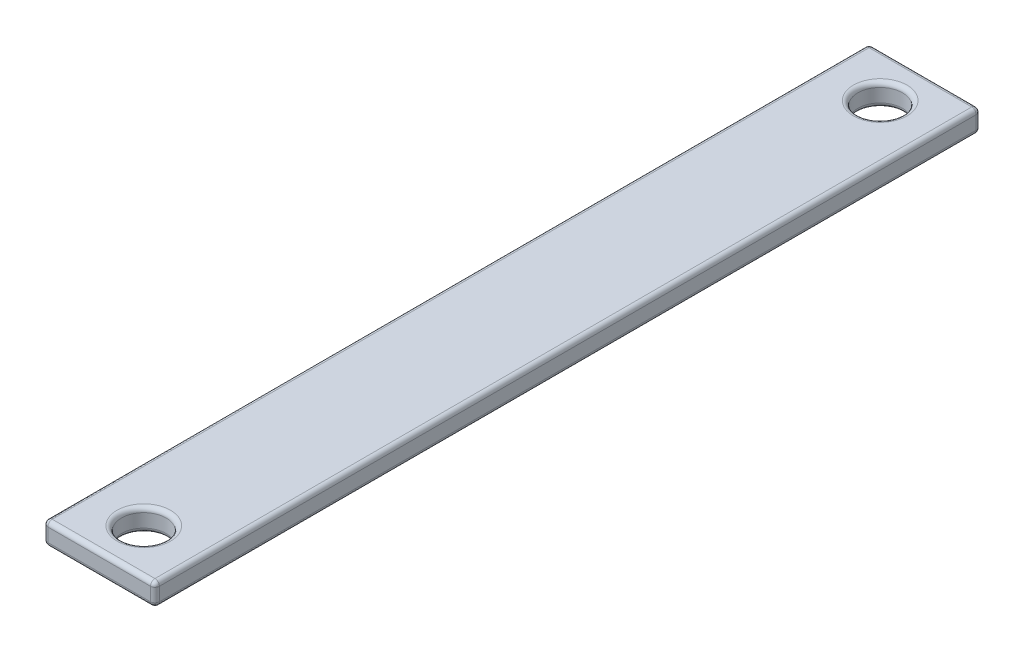
ISO-10303-21;
HEADER;
FILE_DESCRIPTION(('STEP AP214'),'2;1');
FILE_NAME('part.step','',(''),(''),'','','');
FILE_SCHEMA(('AUTOMOTIVE_DESIGN { 1 0 10303 214 1 1 1 1 }'));
ENDSEC;
DATA;
#1=APPLICATION_CONTEXT('core data for automotive mechanical design processes');
#2=APPLICATION_PROTOCOL_DEFINITION('international standard','automotive_design',2000,#1);
#3=PRODUCT_CONTEXT('',#1,'mechanical');
#4=PRODUCT('Part','Part','',(#3));
#5=PRODUCT_RELATED_PRODUCT_CATEGORY('part','',(#4));
#6=PRODUCT_DEFINITION_FORMATION('','',#4);
#7=PRODUCT_DEFINITION_CONTEXT('part definition',#1,'design');
#8=PRODUCT_DEFINITION('design','',#6,#7);
#9=PRODUCT_DEFINITION_SHAPE('','',#8);
#10=(LENGTH_UNIT() NAMED_UNIT(*) SI_UNIT(.MILLI.,.METRE.));
#11=(NAMED_UNIT(*) PLANE_ANGLE_UNIT() SI_UNIT($,.RADIAN.));
#12=(NAMED_UNIT(*) SI_UNIT($,.STERADIAN.) SOLID_ANGLE_UNIT());
#13=UNCERTAINTY_MEASURE_WITH_UNIT(LENGTH_MEASURE(1.E-05),#10,'distance_accuracy_value','');
#14=(GEOMETRIC_REPRESENTATION_CONTEXT(3) GLOBAL_UNCERTAINTY_ASSIGNED_CONTEXT((#13)) GLOBAL_UNIT_ASSIGNED_CONTEXT((#10,
#11,#12)) REPRESENTATION_CONTEXT('',''));
#15=CARTESIAN_POINT('',(0.,0.,0.));
#16=DIRECTION('',(0.,0.,1.));
#17=DIRECTION('',(1.,0.,0.));
#18=AXIS2_PLACEMENT_3D('',#15,#16,#17);
#19=CARTESIAN_POINT('',(0.,10.,0.));
#20=DIRECTION('',(0.,-1.,0.));
#21=DIRECTION('',(0.,0.,-1.));
#22=AXIS2_PLACEMENT_3D('',#19,#20,#21);
#23=PLANE('',#22);
#24=CARTESIAN_POINT('',(0.,10.,165.));
#25=DIRECTION('',(0.,-1.,0.));
#26=DIRECTION('',(0.,0.,-1.));
#27=AXIS2_PLACEMENT_3D('',#24,#25,#26);
#28=CIRCLE('',#27,12.);
#29=CARTESIAN_POINT('',(0.,10.,153.));
#30=VERTEX_POINT('',#29);
#31=EDGE_CURVE('E171',#30,#30,#28,.T.);
#32=ORIENTED_EDGE('',*,*,#31,.T.);
#33=EDGE_LOOP('',(#32));
#34=FACE_BOUND('',#33,.T.);
#35=CARTESIAN_POINT('',(0.,10.,-165.));
#36=DIRECTION('',(0.,-1.,0.));
#37=DIRECTION('',(0.,0.,-1.));
#38=AXIS2_PLACEMENT_3D('',#35,#36,#37);
#39=CIRCLE('',#38,12.);
#40=CARTESIAN_POINT('',(0.,10.,-177.));
#41=VERTEX_POINT('',#40);
#42=EDGE_CURVE('E168',#41,#41,#39,.T.);
#43=ORIENTED_EDGE('',*,*,#42,.T.);
#44=EDGE_LOOP('',(#43));
#45=FACE_BOUND('',#44,.T.);
#46=DIRECTION('',(0.,0.,1.));
#47=VECTOR('',#46,1.);
#48=CARTESIAN_POINT('',(-23.,10.,0.));
#49=LINE('',#48,#47);
#50=CARTESIAN_POINT('',(-23.,10.,-183.));
#51=VERTEX_POINT('',#50);
#52=CARTESIAN_POINT('',(-23.,10.,183.));
#53=VERTEX_POINT('',#52);
#54=EDGE_CURVE('E167',#51,#53,#49,.T.);
#55=ORIENTED_EDGE('',*,*,#54,.T.);
#56=DIRECTION('',(1.,0.,0.));
#57=VECTOR('',#56,1.);
#58=CARTESIAN_POINT('',(0.,10.,183.));
#59=LINE('',#58,#57);
#60=CARTESIAN_POINT('',(23.,10.,183.));
#61=VERTEX_POINT('',#60);
#62=EDGE_CURVE('E147',#53,#61,#59,.T.);
#63=ORIENTED_EDGE('',*,*,#62,.T.);
#64=DIRECTION('',(0.,0.,-1.));
#65=VECTOR('',#64,1.);
#66=CARTESIAN_POINT('',(23.,10.,0.));
#67=LINE('',#66,#65);
#68=CARTESIAN_POINT('',(23.,10.,-183.));
#69=VERTEX_POINT('',#68);
#70=EDGE_CURVE('E156',#61,#69,#67,.T.);
#71=ORIENTED_EDGE('',*,*,#70,.T.);
#72=DIRECTION('',(-1.,0.,0.));
#73=VECTOR('',#72,1.);
#74=CARTESIAN_POINT('',(0.,10.,-183.));
#75=LINE('',#74,#73);
#76=EDGE_CURVE('E162',#69,#51,#75,.T.);
#77=ORIENTED_EDGE('',*,*,#76,.T.);
#78=EDGE_LOOP('',(#55,#63,#71,#77));
#79=FACE_BOUND('',#78,.T.);
#80=ADVANCED_FACE('F37',(#34,#45,#79),#23,.F.);
#81=CARTESIAN_POINT('',(0.,0.,0.));
#82=DIRECTION('',(0.,-1.,0.));
#83=DIRECTION('',(0.,0.,-1.));
#84=AXIS2_PLACEMENT_3D('',#81,#82,#83);
#85=PLANE('',#84);
#86=CARTESIAN_POINT('',(0.,0.,165.));
#87=DIRECTION('',(0.,-1.,0.));
#88=DIRECTION('',(0.,0.,-1.));
#89=AXIS2_PLACEMENT_3D('',#86,#87,#88);
#90=CIRCLE('',#89,12.);
#91=CARTESIAN_POINT('',(0.,0.,153.));
#92=VERTEX_POINT('',#91);
#93=EDGE_CURVE('E152',#92,#92,#90,.F.);
#94=ORIENTED_EDGE('',*,*,#93,.T.);
#95=EDGE_LOOP('',(#94));
#96=FACE_BOUND('',#95,.T.);
#97=DIRECTION('',(0.,0.,1.));
#98=VECTOR('',#97,1.);
#99=CARTESIAN_POINT('',(-23.,0.,-185.));
#100=LINE('',#99,#98);
#101=CARTESIAN_POINT('',(-23.,0.,183.));
#102=VERTEX_POINT('',#101);
#103=CARTESIAN_POINT('',(-23.,0.,-183.));
#104=VERTEX_POINT('',#103);
#105=EDGE_CURVE('E212',#102,#104,#100,.F.);
#106=ORIENTED_EDGE('',*,*,#105,.T.);
#107=DIRECTION('',(-1.,0.,0.));
#108=VECTOR('',#107,1.);
#109=CARTESIAN_POINT('',(25.,0.,-183.));
#110=LINE('',#109,#108);
#111=CARTESIAN_POINT('',(23.,0.,-183.));
#112=VERTEX_POINT('',#111);
#113=EDGE_CURVE('E215',#104,#112,#110,.F.);
#114=ORIENTED_EDGE('',*,*,#113,.T.);
#115=DIRECTION('',(0.,0.,-1.));
#116=VECTOR('',#115,1.);
#117=CARTESIAN_POINT('',(23.,0.,185.));
#118=LINE('',#117,#116);
#119=CARTESIAN_POINT('',(23.,0.,183.));
#120=VERTEX_POINT('',#119);
#121=EDGE_CURVE('E206',#112,#120,#118,.F.);
#122=ORIENTED_EDGE('',*,*,#121,.T.);
#123=DIRECTION('',(1.,0.,0.));
#124=VECTOR('',#123,1.);
#125=CARTESIAN_POINT('',(-25.,0.,183.));
#126=LINE('',#125,#124);
#127=EDGE_CURVE('E209',#120,#102,#126,.F.);
#128=ORIENTED_EDGE('',*,*,#127,.T.);
#129=EDGE_LOOP('',(#106,#114,#122,#128));
#130=FACE_BOUND('',#129,.T.);
#131=CARTESIAN_POINT('',(0.,0.,-165.));
#132=DIRECTION('',(0.,-1.,0.));
#133=DIRECTION('',(0.,0.,-1.));
#134=AXIS2_PLACEMENT_3D('',#131,#132,#133);
#135=CIRCLE('',#134,12.);
#136=CARTESIAN_POINT('',(0.,0.,-177.));
#137=VERTEX_POINT('',#136);
#138=EDGE_CURVE('E203',#137,#137,#135,.F.);
#139=ORIENTED_EDGE('',*,*,#138,.T.);
#140=EDGE_LOOP('',(#139));
#141=FACE_BOUND('',#140,.T.);
#142=ADVANCED_FACE('F292',(#96,#130,#141),#85,.T.);
#143=CARTESIAN_POINT('',(25.,10.,185.));
#144=DIRECTION('',(-1.,0.,0.));
#145=DIRECTION('',(0.,0.,1.));
#146=AXIS2_PLACEMENT_3D('',#143,#144,#145);
#147=PLANE('',#146);
#148=DIRECTION('',(0.,0.,-1.));
#149=VECTOR('',#148,1.);
#150=CARTESIAN_POINT('',(25.,8.,185.));
#151=LINE('',#150,#149);
#152=CARTESIAN_POINT('',(25.,8.,-183.));
#153=VERTEX_POINT('',#152);
#154=CARTESIAN_POINT('',(25.,8.,183.));
#155=VERTEX_POINT('',#154);
#156=EDGE_CURVE('E201',#153,#155,#151,.F.);
#157=ORIENTED_EDGE('',*,*,#156,.T.);
#158=DIRECTION('',(0.,-1.,0.));
#159=VECTOR('',#158,1.);
#160=CARTESIAN_POINT('',(25.,10.,183.));
#161=LINE('',#160,#159);
#162=CARTESIAN_POINT('',(25.,2.,183.));
#163=VERTEX_POINT('',#162);
#164=EDGE_CURVE('E255',#155,#163,#161,.T.);
#165=ORIENTED_EDGE('',*,*,#164,.T.);
#166=DIRECTION('',(0.,0.,-1.));
#167=VECTOR('',#166,1.);
#168=CARTESIAN_POINT('',(25.,2.,-185.));
#169=LINE('',#168,#167);
#170=CARTESIAN_POINT('',(25.,2.,-183.));
#171=VERTEX_POINT('',#170);
#172=EDGE_CURVE('E198',#163,#171,#169,.T.);
#173=ORIENTED_EDGE('',*,*,#172,.T.);
#174=DIRECTION('',(0.,-1.,0.));
#175=VECTOR('',#174,1.);
#176=CARTESIAN_POINT('',(25.,10.,-183.));
#177=LINE('',#176,#175);
#178=EDGE_CURVE('E253',#171,#153,#177,.F.);
#179=ORIENTED_EDGE('',*,*,#178,.T.);
#180=EDGE_LOOP('',(#157,#165,#173,#179));
#181=FACE_BOUND('',#180,.T.);
#182=ADVANCED_FACE('F350',(#181),#147,.F.);
#183=CARTESIAN_POINT('',(-25.,10.,-185.));
#184=DIRECTION('',(0.,0.,1.));
#185=DIRECTION('',(1.,0.,0.));
#186=AXIS2_PLACEMENT_3D('',#183,#184,#185);
#187=PLANE('',#186);
#188=DIRECTION('',(-1.,0.,0.));
#189=VECTOR('',#188,1.);
#190=CARTESIAN_POINT('',(-25.,8.,-185.));
#191=LINE('',#190,#189);
#192=CARTESIAN_POINT('',(-23.,8.,-185.));
#193=VERTEX_POINT('',#192);
#194=CARTESIAN_POINT('',(23.,8.,-185.));
#195=VERTEX_POINT('',#194);
#196=EDGE_CURVE('E196',#193,#195,#191,.F.);
#197=ORIENTED_EDGE('',*,*,#196,.T.);
#198=DIRECTION('',(0.,-1.,0.));
#199=VECTOR('',#198,1.);
#200=CARTESIAN_POINT('',(23.,10.,-185.));
#201=LINE('',#200,#199);
#202=CARTESIAN_POINT('',(23.,2.,-185.));
#203=VERTEX_POINT('',#202);
#204=EDGE_CURVE('E12',#195,#203,#201,.T.);
#205=ORIENTED_EDGE('',*,*,#204,.T.);
#206=DIRECTION('',(-1.,0.,0.));
#207=VECTOR('',#206,1.);
#208=CARTESIAN_POINT('',(-25.,2.,-185.));
#209=LINE('',#208,#207);
#210=CARTESIAN_POINT('',(-23.,2.,-185.));
#211=VERTEX_POINT('',#210);
#212=EDGE_CURVE('E194',#203,#211,#209,.T.);
#213=ORIENTED_EDGE('',*,*,#212,.T.);
#214=DIRECTION('',(0.,-1.,0.));
#215=VECTOR('',#214,1.);
#216=CARTESIAN_POINT('',(-23.,10.,-185.));
#217=LINE('',#216,#215);
#218=EDGE_CURVE('E46',#211,#193,#217,.F.);
#219=ORIENTED_EDGE('',*,*,#218,.T.);
#220=EDGE_LOOP('',(#197,#205,#213,#219));
#221=FACE_BOUND('',#220,.T.);
#222=ADVANCED_FACE('F362',(#221),#187,.F.);
#223=CARTESIAN_POINT('',(-25.,10.,185.));
#224=DIRECTION('',(1.,0.,0.));
#225=DIRECTION('',(0.,0.,-1.));
#226=AXIS2_PLACEMENT_3D('',#223,#224,#225);
#227=PLANE('',#226);
#228=DIRECTION('',(0.,0.,1.));
#229=VECTOR('',#228,1.);
#230=CARTESIAN_POINT('',(-25.,2.,185.));
#231=LINE('',#230,#229);
#232=CARTESIAN_POINT('',(-25.,2.,-183.));
#233=VERTEX_POINT('',#232);
#234=CARTESIAN_POINT('',(-25.,2.,183.));
#235=VERTEX_POINT('',#234);
#236=EDGE_CURVE('E188',#233,#235,#231,.T.);
#237=ORIENTED_EDGE('',*,*,#236,.T.);
#238=DIRECTION('',(0.,-1.,0.));
#239=VECTOR('',#238,1.);
#240=CARTESIAN_POINT('',(-25.,10.,183.));
#241=LINE('',#240,#239);
#242=CARTESIAN_POINT('',(-25.,8.,183.));
#243=VERTEX_POINT('',#242);
#244=EDGE_CURVE('E251',#235,#243,#241,.F.);
#245=ORIENTED_EDGE('',*,*,#244,.T.);
#246=DIRECTION('',(0.,0.,1.));
#247=VECTOR('',#246,1.);
#248=CARTESIAN_POINT('',(-25.,8.,185.));
#249=LINE('',#248,#247);
#250=CARTESIAN_POINT('',(-25.,8.,-183.));
#251=VERTEX_POINT('',#250);
#252=EDGE_CURVE('E191',#243,#251,#249,.F.);
#253=ORIENTED_EDGE('',*,*,#252,.T.);
#254=DIRECTION('',(0.,-1.,0.));
#255=VECTOR('',#254,1.);
#256=CARTESIAN_POINT('',(-25.,10.,-183.));
#257=LINE('',#256,#255);
#258=EDGE_CURVE('E249',#251,#233,#257,.T.);
#259=ORIENTED_EDGE('',*,*,#258,.T.);
#260=EDGE_LOOP('',(#237,#245,#253,#259));
#261=FACE_BOUND('',#260,.T.);
#262=ADVANCED_FACE('F329',(#261),#227,.F.);
#263=CARTESIAN_POINT('',(-25.,10.,185.));
#264=DIRECTION('',(0.,0.,-1.));
#265=DIRECTION('',(-1.,0.,0.));
#266=AXIS2_PLACEMENT_3D('',#263,#264,#265);
#267=PLANE('',#266);
#268=DIRECTION('',(1.,0.,0.));
#269=VECTOR('',#268,1.);
#270=CARTESIAN_POINT('',(-25.,8.,185.));
#271=LINE('',#270,#269);
#272=CARTESIAN_POINT('',(23.,8.,185.));
#273=VERTEX_POINT('',#272);
#274=CARTESIAN_POINT('',(-23.,8.,185.));
#275=VERTEX_POINT('',#274);
#276=EDGE_CURVE('E150',#273,#275,#271,.F.);
#277=ORIENTED_EDGE('',*,*,#276,.T.);
#278=DIRECTION('',(0.,-1.,0.));
#279=VECTOR('',#278,1.);
#280=CARTESIAN_POINT('',(-23.,10.,185.));
#281=LINE('',#280,#279);
#282=CARTESIAN_POINT('',(-23.,2.,185.));
#283=VERTEX_POINT('',#282);
#284=EDGE_CURVE('E247',#275,#283,#281,.T.);
#285=ORIENTED_EDGE('',*,*,#284,.T.);
#286=DIRECTION('',(1.,0.,0.));
#287=VECTOR('',#286,1.);
#288=CARTESIAN_POINT('',(25.,2.,185.));
#289=LINE('',#288,#287);
#290=CARTESIAN_POINT('',(23.,2.,185.));
#291=VERTEX_POINT('',#290);
#292=EDGE_CURVE('E184',#283,#291,#289,.T.);
#293=ORIENTED_EDGE('',*,*,#292,.T.);
#294=DIRECTION('',(0.,-1.,0.));
#295=VECTOR('',#294,1.);
#296=CARTESIAN_POINT('',(23.,10.,185.));
#297=LINE('',#296,#295);
#298=EDGE_CURVE('E245',#291,#273,#297,.F.);
#299=ORIENTED_EDGE('',*,*,#298,.T.);
#300=EDGE_LOOP('',(#277,#285,#293,#299));
#301=FACE_BOUND('',#300,.T.);
#302=ADVANCED_FACE('F318',(#301),#267,.F.);
#303=CARTESIAN_POINT('',(0.,10.,-165.));
#304=DIRECTION('',(0.,-1.,0.));
#305=DIRECTION('',(0.,0.,-1.));
#306=AXIS2_PLACEMENT_3D('',#303,#304,#305);
#307=CYLINDRICAL_SURFACE('',#306,10.);
#308=CARTESIAN_POINT('',(0.,8.,-165.));
#309=DIRECTION('',(0.,-1.,0.));
#310=DIRECTION('',(0.,0.,-1.));
#311=AXIS2_PLACEMENT_3D('',#308,#309,#310);
#312=CIRCLE('',#311,10.);
#313=CARTESIAN_POINT('',(0.,8.,-175.));
#314=VERTEX_POINT('',#313);
#315=EDGE_CURVE('E181',#314,#314,#312,.F.);
#316=ORIENTED_EDGE('',*,*,#315,.T.);
#317=EDGE_LOOP('',(#316));
#318=FACE_BOUND('',#317,.T.);
#319=CARTESIAN_POINT('',(0.,2.,-165.));
#320=DIRECTION('',(0.,-1.,0.));
#321=DIRECTION('',(0.,0.,-1.));
#322=AXIS2_PLACEMENT_3D('',#319,#320,#321);
#323=CIRCLE('',#322,10.);
#324=CARTESIAN_POINT('',(0.,2.,-175.));
#325=VERTEX_POINT('',#324);
#326=EDGE_CURVE('E178',#325,#325,#323,.T.);
#327=ORIENTED_EDGE('',*,*,#326,.T.);
#328=EDGE_LOOP('',(#327));
#329=FACE_BOUND('',#328,.T.);
#330=ADVANCED_FACE('F355',(#318,#329),#307,.F.);
#331=CARTESIAN_POINT('',(0.,10.,165.));
#332=DIRECTION('',(0.,-1.,0.));
#333=DIRECTION('',(0.,0.,-1.));
#334=AXIS2_PLACEMENT_3D('',#331,#332,#333);
#335=CYLINDRICAL_SURFACE('',#334,10.);
#336=CARTESIAN_POINT('',(0.,8.,165.));
#337=DIRECTION('',(0.,-1.,0.));
#338=DIRECTION('',(0.,0.,-1.));
#339=AXIS2_PLACEMENT_3D('',#336,#337,#338);
#340=CIRCLE('',#339,10.);
#341=CARTESIAN_POINT('',(0.,8.,155.));
#342=VERTEX_POINT('',#341);
#343=EDGE_CURVE('E163',#342,#342,#340,.F.);
#344=ORIENTED_EDGE('',*,*,#343,.T.);
#345=EDGE_LOOP('',(#344));
#346=FACE_BOUND('',#345,.T.);
#347=CARTESIAN_POINT('',(0.,2.,165.));
#348=DIRECTION('',(0.,-1.,0.));
#349=DIRECTION('',(0.,0.,-1.));
#350=AXIS2_PLACEMENT_3D('',#347,#348,#349);
#351=CIRCLE('',#350,10.);
#352=CARTESIAN_POINT('',(0.,2.,155.));
#353=VERTEX_POINT('',#352);
#354=EDGE_CURVE('E264',#353,#353,#351,.T.);
#355=ORIENTED_EDGE('',*,*,#354,.T.);
#356=EDGE_LOOP('',(#355));
#357=FACE_BOUND('',#356,.T.);
#358=ADVANCED_FACE('F372',(#346,#357),#335,.F.);
#359=CARTESIAN_POINT('',(0.,8.,165.));
#360=DIRECTION('',(0.,-1.,0.));
#361=DIRECTION('',(0.,0.,-1.));
#362=AXIS2_PLACEMENT_3D('',#359,#360,#361);
#363=TOROIDAL_SURFACE('',#362,12.,2.);
#364=ORIENTED_EDGE('',*,*,#31,.F.);
#365=EDGE_LOOP('',(#364));
#366=FACE_BOUND('',#365,.T.);
#367=ORIENTED_EDGE('',*,*,#343,.F.);
#368=EDGE_LOOP('',(#367));
#369=FACE_BOUND('',#368,.T.);
#370=ADVANCED_FACE('F368',(#366,#369),#363,.T.);
#371=CARTESIAN_POINT('',(0.,8.,-165.));
#372=DIRECTION('',(0.,-1.,0.));
#373=DIRECTION('',(0.,0.,-1.));
#374=AXIS2_PLACEMENT_3D('',#371,#372,#373);
#375=TOROIDAL_SURFACE('',#374,12.,2.);
#376=ORIENTED_EDGE('',*,*,#42,.F.);
#377=EDGE_LOOP('',(#376));
#378=FACE_BOUND('',#377,.T.);
#379=ORIENTED_EDGE('',*,*,#315,.F.);
#380=EDGE_LOOP('',(#379));
#381=FACE_BOUND('',#380,.T.);
#382=ADVANCED_FACE('F371',(#378,#381),#375,.T.);
#383=CARTESIAN_POINT('',(0.,8.,-183.));
#384=DIRECTION('',(-1.,0.,0.));
#385=DIRECTION('',(0.,0.,1.));
#386=AXIS2_PLACEMENT_3D('',#383,#384,#385);
#387=CYLINDRICAL_SURFACE('',#386,2.);
#388=ORIENTED_EDGE('',*,*,#76,.F.);
#389=CARTESIAN_POINT('',(23.,8.,-183.));
#390=DIRECTION('',(-1.,0.,0.));
#391=DIRECTION('',(0.,0.,1.));
#392=AXIS2_PLACEMENT_3D('',#389,#390,#391);
#393=CIRCLE('',#392,2.);
#394=EDGE_CURVE('E240',#69,#195,#393,.T.);
#395=ORIENTED_EDGE('',*,*,#394,.T.);
#396=ORIENTED_EDGE('',*,*,#196,.F.);
#397=CARTESIAN_POINT('',(-23.,8.,-183.));
#398=DIRECTION('',(-1.,0.,0.));
#399=DIRECTION('',(0.,0.,1.));
#400=AXIS2_PLACEMENT_3D('',#397,#398,#399);
#401=CIRCLE('',#400,2.);
#402=EDGE_CURVE('E238',#193,#51,#401,.F.);
#403=ORIENTED_EDGE('',*,*,#402,.T.);
#404=EDGE_LOOP('',(#388,#395,#396,#403));
#405=FACE_BOUND('',#404,.T.);
#406=ADVANCED_FACE('F376',(#405),#387,.T.);
#407=CARTESIAN_POINT('',(-23.,8.,0.));
#408=DIRECTION('',(0.,0.,1.));
#409=DIRECTION('',(1.,0.,0.));
#410=AXIS2_PLACEMENT_3D('',#407,#408,#409);
#411=CYLINDRICAL_SURFACE('',#410,2.);
#412=ORIENTED_EDGE('',*,*,#252,.F.);
#413=CARTESIAN_POINT('',(-23.,8.,183.));
#414=DIRECTION('',(0.,0.,1.));
#415=DIRECTION('',(1.,0.,0.));
#416=AXIS2_PLACEMENT_3D('',#413,#414,#415);
#417=CIRCLE('',#416,2.);
#418=EDGE_CURVE('E224',#243,#53,#417,.F.);
#419=ORIENTED_EDGE('',*,*,#418,.T.);
#420=ORIENTED_EDGE('',*,*,#54,.F.);
#421=CARTESIAN_POINT('',(-23.,8.,-183.));
#422=DIRECTION('',(0.,0.,1.));
#423=DIRECTION('',(1.,0.,0.));
#424=AXIS2_PLACEMENT_3D('',#421,#422,#423);
#425=CIRCLE('',#424,2.);
#426=EDGE_CURVE('E221',#51,#251,#425,.T.);
#427=ORIENTED_EDGE('',*,*,#426,.T.);
#428=EDGE_LOOP('',(#412,#419,#420,#427));
#429=FACE_BOUND('',#428,.T.);
#430=ADVANCED_FACE('F332',(#429),#411,.T.);
#431=CARTESIAN_POINT('',(23.,8.,0.));
#432=DIRECTION('',(0.,0.,-1.));
#433=DIRECTION('',(-1.,0.,0.));
#434=AXIS2_PLACEMENT_3D('',#431,#432,#433);
#435=CYLINDRICAL_SURFACE('',#434,2.);
#436=ORIENTED_EDGE('',*,*,#70,.F.);
#437=CARTESIAN_POINT('',(23.,8.,183.));
#438=DIRECTION('',(0.,0.,-1.));
#439=DIRECTION('',(-1.,0.,0.));
#440=AXIS2_PLACEMENT_3D('',#437,#438,#439);
#441=CIRCLE('',#440,2.);
#442=EDGE_CURVE('E128',#61,#155,#441,.T.);
#443=ORIENTED_EDGE('',*,*,#442,.T.);
#444=ORIENTED_EDGE('',*,*,#156,.F.);
#445=CARTESIAN_POINT('',(23.,8.,-183.));
#446=DIRECTION('',(0.,0.,-1.));
#447=DIRECTION('',(-1.,0.,0.));
#448=AXIS2_PLACEMENT_3D('',#445,#446,#447);
#449=CIRCLE('',#448,2.);
#450=EDGE_CURVE('E139',#153,#69,#449,.F.);
#451=ORIENTED_EDGE('',*,*,#450,.T.);
#452=EDGE_LOOP('',(#436,#443,#444,#451));
#453=FACE_BOUND('',#452,.T.);
#454=ADVANCED_FACE('F157',(#453),#435,.T.);
#455=CARTESIAN_POINT('',(0.,8.,183.));
#456=DIRECTION('',(1.,0.,0.));
#457=DIRECTION('',(0.,0.,-1.));
#458=AXIS2_PLACEMENT_3D('',#455,#456,#457);
#459=CYLINDRICAL_SURFACE('',#458,2.);
#460=ORIENTED_EDGE('',*,*,#62,.F.);
#461=CARTESIAN_POINT('',(-23.,8.,183.));
#462=DIRECTION('',(1.,0.,0.));
#463=DIRECTION('',(0.,0.,-1.));
#464=AXIS2_PLACEMENT_3D('',#461,#462,#463);
#465=CIRCLE('',#464,2.);
#466=EDGE_CURVE('E151',#53,#275,#465,.T.);
#467=ORIENTED_EDGE('',*,*,#466,.T.);
#468=ORIENTED_EDGE('',*,*,#276,.F.);
#469=CARTESIAN_POINT('',(23.,8.,183.));
#470=DIRECTION('',(1.,0.,0.));
#471=DIRECTION('',(0.,0.,-1.));
#472=AXIS2_PLACEMENT_3D('',#469,#470,#471);
#473=CIRCLE('',#472,2.);
#474=EDGE_CURVE('E131',#273,#61,#473,.F.);
#475=ORIENTED_EDGE('',*,*,#474,.T.);
#476=EDGE_LOOP('',(#460,#467,#468,#475));
#477=FACE_BOUND('',#476,.T.);
#478=ADVANCED_FACE('F144',(#477),#459,.T.);
#479=CARTESIAN_POINT('',(0.,2.,165.));
#480=DIRECTION('',(0.,-1.,0.));
#481=DIRECTION('',(0.,0.,-1.));
#482=AXIS2_PLACEMENT_3D('',#479,#480,#481);
#483=TOROIDAL_SURFACE('',#482,12.,2.);
#484=ORIENTED_EDGE('',*,*,#354,.F.);
#485=EDGE_LOOP('',(#484));
#486=FACE_BOUND('',#485,.T.);
#487=ORIENTED_EDGE('',*,*,#93,.F.);
#488=EDGE_LOOP('',(#487));
#489=FACE_BOUND('',#488,.T.);
#490=ADVANCED_FACE('F380',(#486,#489),#483,.T.);
#491=CARTESIAN_POINT('',(-25.,2.,183.));
#492=DIRECTION('',(-1.,0.,0.));
#493=DIRECTION('',(0.,0.,1.));
#494=AXIS2_PLACEMENT_3D('',#491,#492,#493);
#495=CYLINDRICAL_SURFACE('',#494,2.);
#496=ORIENTED_EDGE('',*,*,#292,.F.);
#497=CARTESIAN_POINT('',(-23.,2.,183.));
#498=DIRECTION('',(-1.,0.,0.));
#499=DIRECTION('',(0.,0.,1.));
#500=AXIS2_PLACEMENT_3D('',#497,#498,#499);
#501=CIRCLE('',#500,2.);
#502=EDGE_CURVE('E232',#283,#102,#501,.F.);
#503=ORIENTED_EDGE('',*,*,#502,.T.);
#504=ORIENTED_EDGE('',*,*,#127,.F.);
#505=CARTESIAN_POINT('',(23.,2.,183.));
#506=DIRECTION('',(-1.,0.,0.));
#507=DIRECTION('',(0.,0.,1.));
#508=AXIS2_PLACEMENT_3D('',#505,#506,#507);
#509=CIRCLE('',#508,2.);
#510=EDGE_CURVE('E230',#120,#291,#509,.T.);
#511=ORIENTED_EDGE('',*,*,#510,.T.);
#512=EDGE_LOOP('',(#496,#503,#504,#511));
#513=FACE_BOUND('',#512,.T.);
#514=ADVANCED_FACE('F308',(#513),#495,.T.);
#515=CARTESIAN_POINT('',(23.,2.,185.));
#516=DIRECTION('',(0.,0.,1.));
#517=DIRECTION('',(1.,0.,0.));
#518=AXIS2_PLACEMENT_3D('',#515,#516,#517);
#519=CYLINDRICAL_SURFACE('',#518,2.);
#520=ORIENTED_EDGE('',*,*,#172,.F.);
#521=CARTESIAN_POINT('',(23.,2.,183.));
#522=DIRECTION('',(0.,0.,1.));
#523=DIRECTION('',(1.,0.,0.));
#524=AXIS2_PLACEMENT_3D('',#521,#522,#523);
#525=CIRCLE('',#524,2.);
#526=EDGE_CURVE('E236',#163,#120,#525,.F.);
#527=ORIENTED_EDGE('',*,*,#526,.T.);
#528=ORIENTED_EDGE('',*,*,#121,.F.);
#529=CARTESIAN_POINT('',(23.,2.,-183.));
#530=DIRECTION('',(0.,0.,1.));
#531=DIRECTION('',(1.,0.,0.));
#532=AXIS2_PLACEMENT_3D('',#529,#530,#531);
#533=CIRCLE('',#532,2.);
#534=EDGE_CURVE('E138',#112,#171,#533,.T.);
#535=ORIENTED_EDGE('',*,*,#534,.T.);
#536=EDGE_LOOP('',(#520,#527,#528,#535));
#537=FACE_BOUND('',#536,.T.);
#538=ADVANCED_FACE('F303',(#537),#519,.T.);
#539=CARTESIAN_POINT('',(-23.,2.,185.));
#540=DIRECTION('',(0.,0.,-1.));
#541=DIRECTION('',(-1.,0.,0.));
#542=AXIS2_PLACEMENT_3D('',#539,#540,#541);
#543=CYLINDRICAL_SURFACE('',#542,2.);
#544=ORIENTED_EDGE('',*,*,#105,.F.);
#545=CARTESIAN_POINT('',(-23.,2.,183.));
#546=DIRECTION('',(0.,0.,-1.));
#547=DIRECTION('',(-1.,0.,0.));
#548=AXIS2_PLACEMENT_3D('',#545,#546,#547);
#549=CIRCLE('',#548,2.);
#550=EDGE_CURVE('E228',#102,#235,#549,.T.);
#551=ORIENTED_EDGE('',*,*,#550,.T.);
#552=ORIENTED_EDGE('',*,*,#236,.F.);
#553=CARTESIAN_POINT('',(-23.,2.,-183.));
#554=DIRECTION('',(0.,0.,-1.));
#555=DIRECTION('',(-1.,0.,0.));
#556=AXIS2_PLACEMENT_3D('',#553,#554,#555);
#557=CIRCLE('',#556,2.);
#558=EDGE_CURVE('E226',#233,#104,#557,.F.);
#559=ORIENTED_EDGE('',*,*,#558,.T.);
#560=EDGE_LOOP('',(#544,#551,#552,#559));
#561=FACE_BOUND('',#560,.T.);
#562=ADVANCED_FACE('F289',(#561),#543,.T.);
#563=CARTESIAN_POINT('',(-25.,2.,-183.));
#564=DIRECTION('',(1.,0.,0.));
#565=DIRECTION('',(0.,0.,-1.));
#566=AXIS2_PLACEMENT_3D('',#563,#564,#565);
#567=CYLINDRICAL_SURFACE('',#566,2.);
#568=ORIENTED_EDGE('',*,*,#212,.F.);
#569=CARTESIAN_POINT('',(23.,2.,-183.));
#570=DIRECTION('',(1.,0.,0.));
#571=DIRECTION('',(0.,0.,-1.));
#572=AXIS2_PLACEMENT_3D('',#569,#570,#571);
#573=CIRCLE('',#572,2.);
#574=EDGE_CURVE('E243',#203,#112,#573,.F.);
#575=ORIENTED_EDGE('',*,*,#574,.T.);
#576=ORIENTED_EDGE('',*,*,#113,.F.);
#577=CARTESIAN_POINT('',(-23.,2.,-183.));
#578=DIRECTION('',(1.,0.,0.));
#579=DIRECTION('',(0.,0.,-1.));
#580=AXIS2_PLACEMENT_3D('',#577,#578,#579);
#581=CIRCLE('',#580,2.);
#582=EDGE_CURVE('E54',#104,#211,#581,.T.);
#583=ORIENTED_EDGE('',*,*,#582,.T.);
#584=EDGE_LOOP('',(#568,#575,#576,#583));
#585=FACE_BOUND('',#584,.T.);
#586=ADVANCED_FACE('F296',(#585),#567,.T.);
#587=CARTESIAN_POINT('',(0.,2.,-165.));
#588=DIRECTION('',(0.,-1.,0.));
#589=DIRECTION('',(0.,0.,-1.));
#590=AXIS2_PLACEMENT_3D('',#587,#588,#589);
#591=TOROIDAL_SURFACE('',#590,12.,2.);
#592=ORIENTED_EDGE('',*,*,#326,.F.);
#593=EDGE_LOOP('',(#592));
#594=FACE_BOUND('',#593,.T.);
#595=ORIENTED_EDGE('',*,*,#138,.F.);
#596=EDGE_LOOP('',(#595));
#597=FACE_BOUND('',#596,.T.);
#598=ADVANCED_FACE('F393',(#594,#597),#591,.T.);
#599=CARTESIAN_POINT('',(-23.,2.,183.));
#600=DIRECTION('',(0.,0.,1.));
#601=DIRECTION('',(1.,0.,0.));
#602=AXIS2_PLACEMENT_3D('',#599,#600,#601);
#603=SPHERICAL_SURFACE('',#602,2.);
#604=ORIENTED_EDGE('',*,*,#550,.F.);
#605=ORIENTED_EDGE('',*,*,#502,.F.);
#606=CARTESIAN_POINT('',(-23.,2.,183.));
#607=DIRECTION('',(0.,1.,0.));
#608=DIRECTION('',(0.,0.,1.));
#609=AXIS2_PLACEMENT_3D('',#606,#607,#608);
#610=CIRCLE('',#609,2.);
#611=EDGE_CURVE('E260',#235,#283,#610,.T.);
#612=ORIENTED_EDGE('',*,*,#611,.F.);
#613=EDGE_LOOP('',(#604,#605,#612));
#614=FACE_BOUND('',#613,.T.);
#615=ADVANCED_FACE('F322',(#614),#603,.T.);
#616=CARTESIAN_POINT('',(-23.,10.,183.));
#617=DIRECTION('',(0.,-1.,0.));
#618=DIRECTION('',(0.,0.,-1.));
#619=AXIS2_PLACEMENT_3D('',#616,#617,#618);
#620=CYLINDRICAL_SURFACE('',#619,2.);
#621=ORIENTED_EDGE('',*,*,#611,.T.);
#622=ORIENTED_EDGE('',*,*,#284,.F.);
#623=CARTESIAN_POINT('',(-23.,8.,183.));
#624=DIRECTION('',(0.,1.,0.));
#625=DIRECTION('',(0.,0.,1.));
#626=AXIS2_PLACEMENT_3D('',#623,#624,#625);
#627=CIRCLE('',#626,2.);
#628=EDGE_CURVE('E258',#243,#275,#627,.T.);
#629=ORIENTED_EDGE('',*,*,#628,.F.);
#630=ORIENTED_EDGE('',*,*,#244,.F.);
#631=EDGE_LOOP('',(#621,#622,#629,#630));
#632=FACE_BOUND('',#631,.T.);
#633=ADVANCED_FACE('F325',(#632),#620,.T.);
#634=CARTESIAN_POINT('',(-23.,8.,183.));
#635=DIRECTION('',(0.,0.,1.));
#636=DIRECTION('',(1.,0.,0.));
#637=AXIS2_PLACEMENT_3D('',#634,#635,#636);
#638=SPHERICAL_SURFACE('',#637,2.);
#639=ORIENTED_EDGE('',*,*,#466,.F.);
#640=ORIENTED_EDGE('',*,*,#418,.F.);
#641=ORIENTED_EDGE('',*,*,#628,.T.);
#642=EDGE_LOOP('',(#639,#640,#641));
#643=FACE_BOUND('',#642,.T.);
#644=ADVANCED_FACE('F334',(#643),#638,.T.);
#645=CARTESIAN_POINT('',(23.,2.,183.));
#646=DIRECTION('',(0.,0.,1.));
#647=DIRECTION('',(1.,0.,0.));
#648=AXIS2_PLACEMENT_3D('',#645,#646,#647);
#649=SPHERICAL_SURFACE('',#648,2.);
#650=ORIENTED_EDGE('',*,*,#510,.F.);
#651=ORIENTED_EDGE('',*,*,#526,.F.);
#652=CARTESIAN_POINT('',(23.,2.,183.));
#653=DIRECTION('',(0.,1.,0.));
#654=DIRECTION('',(0.,0.,1.));
#655=AXIS2_PLACEMENT_3D('',#652,#653,#654);
#656=CIRCLE('',#655,2.);
#657=EDGE_CURVE('E261',#291,#163,#656,.T.);
#658=ORIENTED_EDGE('',*,*,#657,.F.);
#659=EDGE_LOOP('',(#650,#651,#658));
#660=FACE_BOUND('',#659,.T.);
#661=ADVANCED_FACE('F312',(#660),#649,.T.);
#662=CARTESIAN_POINT('',(23.,10.,183.));
#663=DIRECTION('',(0.,-1.,0.));
#664=DIRECTION('',(0.,0.,-1.));
#665=AXIS2_PLACEMENT_3D('',#662,#663,#664);
#666=CYLINDRICAL_SURFACE('',#665,2.);
#667=ORIENTED_EDGE('',*,*,#657,.T.);
#668=ORIENTED_EDGE('',*,*,#164,.F.);
#669=CARTESIAN_POINT('',(23.,8.,183.));
#670=DIRECTION('',(0.,1.,0.));
#671=DIRECTION('',(0.,0.,1.));
#672=AXIS2_PLACEMENT_3D('',#669,#670,#671);
#673=CIRCLE('',#672,2.);
#674=EDGE_CURVE('E133',#273,#155,#673,.T.);
#675=ORIENTED_EDGE('',*,*,#674,.F.);
#676=ORIENTED_EDGE('',*,*,#298,.F.);
#677=EDGE_LOOP('',(#667,#668,#675,#676));
#678=FACE_BOUND('',#677,.T.);
#679=ADVANCED_FACE('F316',(#678),#666,.T.);
#680=CARTESIAN_POINT('',(23.,8.,183.));
#681=DIRECTION('',(0.,0.,1.));
#682=DIRECTION('',(1.,0.,0.));
#683=AXIS2_PLACEMENT_3D('',#680,#681,#682);
#684=SPHERICAL_SURFACE('',#683,2.);
#685=ORIENTED_EDGE('',*,*,#674,.T.);
#686=ORIENTED_EDGE('',*,*,#442,.F.);
#687=ORIENTED_EDGE('',*,*,#474,.F.);
#688=EDGE_LOOP('',(#685,#686,#687));
#689=FACE_BOUND('',#688,.T.);
#690=ADVANCED_FACE('F130',(#689),#684,.T.);
#691=CARTESIAN_POINT('',(23.,2.,-183.));
#692=DIRECTION('',(0.,0.,1.));
#693=DIRECTION('',(1.,0.,0.));
#694=AXIS2_PLACEMENT_3D('',#691,#692,#693);
#695=SPHERICAL_SURFACE('',#694,2.);
#696=ORIENTED_EDGE('',*,*,#534,.F.);
#697=ORIENTED_EDGE('',*,*,#574,.F.);
#698=CARTESIAN_POINT('',(23.,2.,-183.));
#699=DIRECTION('',(0.,1.,0.));
#700=DIRECTION('',(0.,0.,1.));
#701=AXIS2_PLACEMENT_3D('',#698,#699,#700);
#702=CIRCLE('',#701,2.);
#703=EDGE_CURVE('E266',#171,#203,#702,.T.);
#704=ORIENTED_EDGE('',*,*,#703,.F.);
#705=EDGE_LOOP('',(#696,#697,#704));
#706=FACE_BOUND('',#705,.T.);
#707=ADVANCED_FACE('F440',(#706),#695,.T.);
#708=CARTESIAN_POINT('',(23.,10.,-183.));
#709=DIRECTION('',(0.,-1.,0.));
#710=DIRECTION('',(0.,0.,-1.));
#711=AXIS2_PLACEMENT_3D('',#708,#709,#710);
#712=CYLINDRICAL_SURFACE('',#711,2.);
#713=ORIENTED_EDGE('',*,*,#703,.T.);
#714=ORIENTED_EDGE('',*,*,#204,.F.);
#715=CARTESIAN_POINT('',(23.,8.,-183.));
#716=DIRECTION('',(0.,1.,0.));
#717=DIRECTION('',(0.,0.,1.));
#718=AXIS2_PLACEMENT_3D('',#715,#716,#717);
#719=CIRCLE('',#718,2.);
#720=EDGE_CURVE('E269',#153,#195,#719,.T.);
#721=ORIENTED_EDGE('',*,*,#720,.F.);
#722=ORIENTED_EDGE('',*,*,#178,.F.);
#723=EDGE_LOOP('',(#713,#714,#721,#722));
#724=FACE_BOUND('',#723,.T.);
#725=ADVANCED_FACE('F430',(#724),#712,.T.);
#726=CARTESIAN_POINT('',(23.,8.,-183.));
#727=DIRECTION('',(0.,0.,1.));
#728=DIRECTION('',(1.,0.,0.));
#729=AXIS2_PLACEMENT_3D('',#726,#727,#728);
#730=SPHERICAL_SURFACE('',#729,2.);
#731=ORIENTED_EDGE('',*,*,#720,.T.);
#732=ORIENTED_EDGE('',*,*,#394,.F.);
#733=ORIENTED_EDGE('',*,*,#450,.F.);
#734=EDGE_LOOP('',(#731,#732,#733));
#735=FACE_BOUND('',#734,.T.);
#736=ADVANCED_FACE('F433',(#735),#730,.T.);
#737=CARTESIAN_POINT('',(-23.,2.,-183.));
#738=DIRECTION('',(0.,0.,1.));
#739=DIRECTION('',(1.,0.,0.));
#740=AXIS2_PLACEMENT_3D('',#737,#738,#739);
#741=SPHERICAL_SURFACE('',#740,2.);
#742=ORIENTED_EDGE('',*,*,#582,.F.);
#743=ORIENTED_EDGE('',*,*,#558,.F.);
#744=CARTESIAN_POINT('',(-23.,2.,-183.));
#745=DIRECTION('',(0.,1.,0.));
#746=DIRECTION('',(0.,0.,1.));
#747=AXIS2_PLACEMENT_3D('',#744,#745,#746);
#748=CIRCLE('',#747,2.);
#749=EDGE_CURVE('E41',#211,#233,#748,.T.);
#750=ORIENTED_EDGE('',*,*,#749,.F.);
#751=EDGE_LOOP('',(#742,#743,#750));
#752=FACE_BOUND('',#751,.T.);
#753=ADVANCED_FACE('F39',(#752),#741,.T.);
#754=CARTESIAN_POINT('',(-23.,10.,-183.));
#755=DIRECTION('',(0.,-1.,0.));
#756=DIRECTION('',(0.,0.,-1.));
#757=AXIS2_PLACEMENT_3D('',#754,#755,#756);
#758=CYLINDRICAL_SURFACE('',#757,2.);
#759=ORIENTED_EDGE('',*,*,#749,.T.);
#760=ORIENTED_EDGE('',*,*,#258,.F.);
#761=CARTESIAN_POINT('',(-23.,8.,-183.));
#762=DIRECTION('',(0.,1.,0.));
#763=DIRECTION('',(0.,0.,1.));
#764=AXIS2_PLACEMENT_3D('',#761,#762,#763);
#765=CIRCLE('',#764,2.);
#766=EDGE_CURVE('E273',#193,#251,#765,.T.);
#767=ORIENTED_EDGE('',*,*,#766,.F.);
#768=ORIENTED_EDGE('',*,*,#218,.F.);
#769=EDGE_LOOP('',(#759,#760,#767,#768));
#770=FACE_BOUND('',#769,.T.);
#771=ADVANCED_FACE('F283',(#770),#758,.T.);
#772=CARTESIAN_POINT('',(-23.,8.,-183.));
#773=DIRECTION('',(0.,0.,1.));
#774=DIRECTION('',(1.,0.,0.));
#775=AXIS2_PLACEMENT_3D('',#772,#773,#774);
#776=SPHERICAL_SURFACE('',#775,2.);
#777=ORIENTED_EDGE('',*,*,#426,.F.);
#778=ORIENTED_EDGE('',*,*,#402,.F.);
#779=ORIENTED_EDGE('',*,*,#766,.T.);
#780=EDGE_LOOP('',(#777,#778,#779));
#781=FACE_BOUND('',#780,.T.);
#782=ADVANCED_FACE('F426',(#781),#776,.T.);
#783=CLOSED_SHELL('',(#80,#142,#182,#222,#262,#302,#330,#358,#370,#382,#406,#430,#454,#478,#490,
#514,#538,#562,#586,#598,#615,#633,#644,#661,#679,#690,#707,#725,#736,#753,#771,#782));
#784=MANIFOLD_SOLID_BREP('B2',#783);
#785=ADVANCED_BREP_SHAPE_REPRESENTATION('',(#18,#784),#14);
#786=SHAPE_DEFINITION_REPRESENTATION(#9,#785);
ENDSEC;
END-ISO-10303-21;
